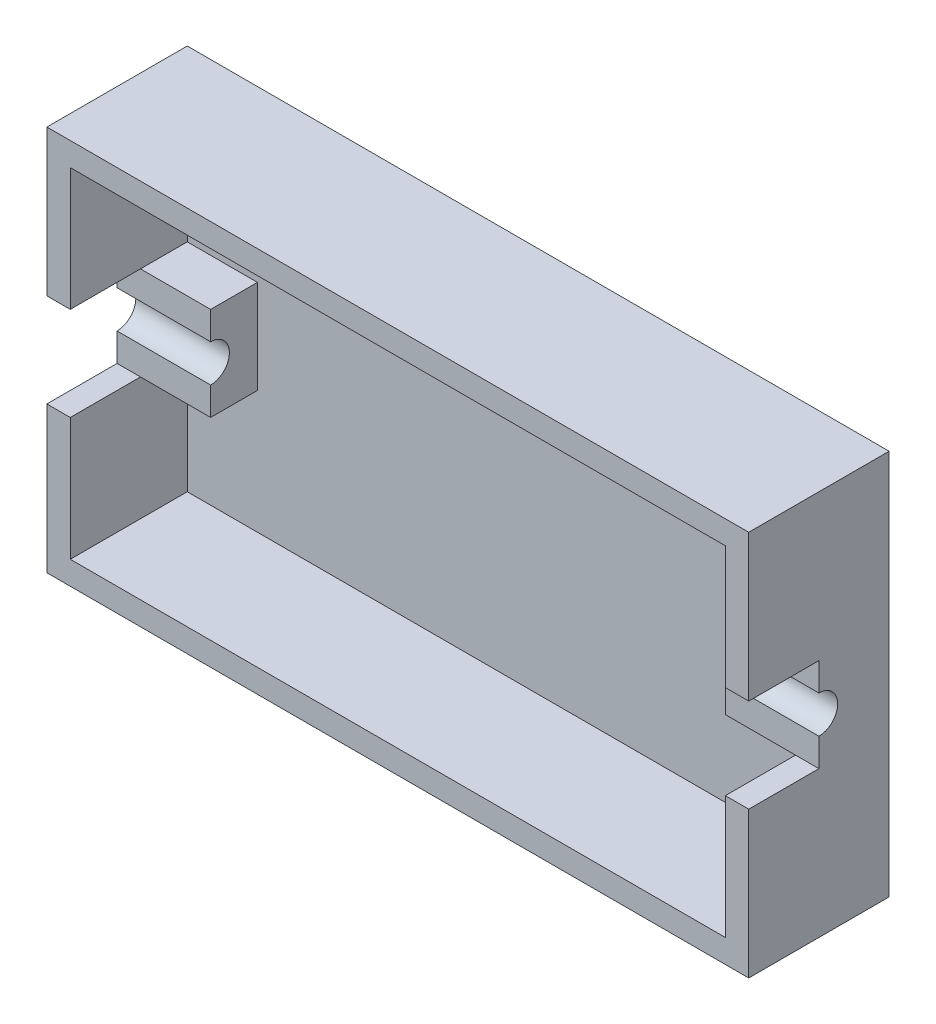
ISO-10303-21;
HEADER;
FILE_DESCRIPTION(('STEP AP214'),'2;1');
FILE_NAME('part.step','',(''),(''),'','','');
FILE_SCHEMA(('AUTOMOTIVE_DESIGN { 1 0 10303 214 1 1 1 1 }'));
ENDSEC;
DATA;
#1=APPLICATION_CONTEXT('core data for automotive mechanical design processes');
#2=APPLICATION_PROTOCOL_DEFINITION('international standard','automotive_design',2000,#1);
#3=PRODUCT_CONTEXT('',#1,'mechanical');
#4=PRODUCT('Part','Part','',(#3));
#5=PRODUCT_RELATED_PRODUCT_CATEGORY('part','',(#4));
#6=PRODUCT_DEFINITION_FORMATION('','',#4);
#7=PRODUCT_DEFINITION_CONTEXT('part definition',#1,'design');
#8=PRODUCT_DEFINITION('design','',#6,#7);
#9=PRODUCT_DEFINITION_SHAPE('','',#8);
#10=(LENGTH_UNIT() NAMED_UNIT(*) SI_UNIT(.MILLI.,.METRE.));
#11=(NAMED_UNIT(*) PLANE_ANGLE_UNIT() SI_UNIT($,.RADIAN.));
#12=(NAMED_UNIT(*) SI_UNIT($,.STERADIAN.) SOLID_ANGLE_UNIT());
#13=UNCERTAINTY_MEASURE_WITH_UNIT(LENGTH_MEASURE(1.E-05),#10,'distance_accuracy_value','');
#14=(GEOMETRIC_REPRESENTATION_CONTEXT(3) GLOBAL_UNCERTAINTY_ASSIGNED_CONTEXT((#13)) GLOBAL_UNIT_ASSIGNED_CONTEXT((#10,
#11,#12)) REPRESENTATION_CONTEXT('',''));
#15=CARTESIAN_POINT('',(0.,0.,0.));
#16=DIRECTION('',(0.,0.,1.));
#17=DIRECTION('',(1.,0.,0.));
#18=AXIS2_PLACEMENT_3D('',#15,#16,#17);
#19=CARTESIAN_POINT('',(0.,0.,30.));
#20=DIRECTION('',(0.,0.,1.));
#21=DIRECTION('',(1.,0.,0.));
#22=AXIS2_PLACEMENT_3D('',#19,#20,#21);
#23=PLANE('',#22);
#24=DIRECTION('',(1.,0.,0.));
#25=VECTOR('',#24,1.);
#26=CARTESIAN_POINT('',(-1.08330852705849E-13,74.5,30.));
#27=LINE('',#26,#25);
#28=CARTESIAN_POINT('',(-1.08330852705849E-13,74.5,30.));
#29=VERTEX_POINT('',#28);
#30=CARTESIAN_POINT('',(39.9999999999999,74.5,30.));
#31=VERTEX_POINT('',#30);
#32=EDGE_CURVE('E399',#29,#31,#27,.T.);
#33=ORIENTED_EDGE('',*,*,#32,.F.);
#34=DIRECTION('',(0.,-1.,0.));
#35=VECTOR('',#34,1.);
#36=CARTESIAN_POINT('',(0.,102.5,30.));
#37=LINE('',#36,#35);
#38=CARTESIAN_POINT('',(0.,62.5,30.));
#39=VERTEX_POINT('',#38);
#40=EDGE_CURVE('E261',#29,#39,#37,.T.);
#41=ORIENTED_EDGE('',*,*,#40,.T.);
#42=DIRECTION('',(1.,0.,0.));
#43=VECTOR('',#42,1.);
#44=CARTESIAN_POINT('',(0.,62.5,30.));
#45=LINE('',#44,#43);
#46=CARTESIAN_POINT('',(9.99999999999998,62.5,30.));
#47=VERTEX_POINT('',#46);
#48=EDGE_CURVE('E262',#39,#47,#45,.T.);
#49=ORIENTED_EDGE('',*,*,#48,.T.);
#50=CARTESIAN_POINT('',(40.,62.5,30.));
#51=VERTEX_POINT('',#50);
#52=EDGE_CURVE('E260',#47,#51,#45,.T.);
#53=ORIENTED_EDGE('',*,*,#52,.T.);
#54=DIRECTION('',(0.,1.,0.));
#55=VECTOR('',#54,1.);
#56=CARTESIAN_POINT('',(39.9999999999999,102.5,30.));
#57=LINE('',#56,#55);
#58=EDGE_CURVE('E266',#51,#31,#57,.T.);
#59=ORIENTED_EDGE('',*,*,#58,.T.);
#60=EDGE_LOOP('',(#33,#41,#49,#53,#59));
#61=FACE_BOUND('',#60,.T.);
#62=ADVANCED_FACE('F41',(#61),#23,.T.);
#63=CARTESIAN_POINT('',(0.,0.,30.));
#64=DIRECTION('',(0.,0.,1.));
#65=DIRECTION('',(1.,0.,0.));
#66=AXIS2_PLACEMENT_3D('',#63,#64,#65);
#67=PLANE('',#66);
#68=DIRECTION('',(1.,0.,0.));
#69=VECTOR('',#68,1.);
#70=CARTESIAN_POINT('',(-1.08330852705849E-13,74.5,30.));
#71=LINE('',#70,#69);
#72=CARTESIAN_POINT('',(260.,74.5000000000001,30.));
#73=VERTEX_POINT('',#72);
#74=CARTESIAN_POINT('',(300.,74.5000000000001,30.));
#75=VERTEX_POINT('',#74);
#76=EDGE_CURVE('E11',#73,#75,#71,.T.);
#77=ORIENTED_EDGE('',*,*,#76,.F.);
#78=DIRECTION('',(0.,-1.,0.));
#79=VECTOR('',#78,1.);
#80=CARTESIAN_POINT('',(260.,102.5,30.));
#81=LINE('',#80,#79);
#82=CARTESIAN_POINT('',(260.,62.5000000000001,30.));
#83=VERTEX_POINT('',#82);
#84=EDGE_CURVE('E317',#73,#83,#81,.T.);
#85=ORIENTED_EDGE('',*,*,#84,.T.);
#86=DIRECTION('',(1.,0.,0.));
#87=VECTOR('',#86,1.);
#88=CARTESIAN_POINT('',(300.,62.5000000000001,30.));
#89=LINE('',#88,#87);
#90=CARTESIAN_POINT('',(290.,62.5000000000001,30.));
#91=VERTEX_POINT('',#90);
#92=EDGE_CURVE('E240',#83,#91,#89,.T.);
#93=ORIENTED_EDGE('',*,*,#92,.T.);
#94=CARTESIAN_POINT('',(300.,62.5000000000001,30.));
#95=VERTEX_POINT('',#94);
#96=EDGE_CURVE('E231',#91,#95,#89,.T.);
#97=ORIENTED_EDGE('',*,*,#96,.T.);
#98=DIRECTION('',(0.,1.,0.));
#99=VECTOR('',#98,1.);
#100=CARTESIAN_POINT('',(300.,102.5,30.));
#101=LINE('',#100,#99);
#102=EDGE_CURVE('E222',#95,#75,#101,.T.);
#103=ORIENTED_EDGE('',*,*,#102,.T.);
#104=EDGE_LOOP('',(#77,#85,#93,#97,#103));
#105=FACE_BOUND('',#104,.T.);
#106=ADVANCED_FACE('F229',(#105),#67,.T.);
#107=CARTESIAN_POINT('',(0.,0.,10.));
#108=DIRECTION('',(0.,0.,-1.));
#109=DIRECTION('',(-1.,0.,0.));
#110=AXIS2_PLACEMENT_3D('',#107,#108,#109);
#111=PLANE('',#110);
#112=DIRECTION('',(1.,0.,0.));
#113=VECTOR('',#112,1.);
#114=CARTESIAN_POINT('',(0.,10.,10.));
#115=LINE('',#114,#113);
#116=CARTESIAN_POINT('',(9.99999999999998,10.,10.));
#117=VERTEX_POINT('',#116);
#118=CARTESIAN_POINT('',(290.,10.,10.));
#119=VERTEX_POINT('',#118);
#120=EDGE_CURVE('E393',#117,#119,#115,.T.);
#121=ORIENTED_EDGE('',*,*,#120,.T.);
#122=DIRECTION('',(0.,1.,0.));
#123=VECTOR('',#122,1.);
#124=CARTESIAN_POINT('',(290.,0.,10.));
#125=LINE('',#124,#123);
#126=CARTESIAN_POINT('',(290.,62.5000000000001,10.));
#127=VERTEX_POINT('',#126);
#128=EDGE_CURVE('E396',#119,#127,#125,.T.);
#129=ORIENTED_EDGE('',*,*,#128,.T.);
#130=DIRECTION('',(1.,0.,0.));
#131=VECTOR('',#130,1.);
#132=CARTESIAN_POINT('',(300.,62.5000000000001,10.));
#133=LINE('',#132,#131);
#134=CARTESIAN_POINT('',(260.,62.5000000000001,10.));
#135=VERTEX_POINT('',#134);
#136=EDGE_CURVE('E250',#135,#127,#133,.T.);
#137=ORIENTED_EDGE('',*,*,#136,.F.);
#138=DIRECTION('',(0.,-1.,0.));
#139=VECTOR('',#138,1.);
#140=CARTESIAN_POINT('',(260.,102.5,10.));
#141=LINE('',#140,#139);
#142=CARTESIAN_POINT('',(260.,102.5,10.));
#143=VERTEX_POINT('',#142);
#144=EDGE_CURVE('E246',#143,#135,#141,.T.);
#145=ORIENTED_EDGE('',*,*,#144,.F.);
#146=DIRECTION('',(-1.,0.,0.));
#147=VECTOR('',#146,1.);
#148=CARTESIAN_POINT('',(300.,102.5,10.));
#149=LINE('',#148,#147);
#150=CARTESIAN_POINT('',(290.,102.5,10.));
#151=VERTEX_POINT('',#150);
#152=EDGE_CURVE('E244',#151,#143,#149,.T.);
#153=ORIENTED_EDGE('',*,*,#152,.F.);
#154=DIRECTION('',(0.,1.,0.));
#155=VECTOR('',#154,1.);
#156=CARTESIAN_POINT('',(290.,0.,10.));
#157=LINE('',#156,#155);
#158=CARTESIAN_POINT('',(290.,155.,10.));
#159=VERTEX_POINT('',#158);
#160=EDGE_CURVE('E341',#151,#159,#157,.T.);
#161=ORIENTED_EDGE('',*,*,#160,.T.);
#162=DIRECTION('',(-1.,0.,0.));
#163=VECTOR('',#162,1.);
#164=CARTESIAN_POINT('',(0.,155.,10.));
#165=LINE('',#164,#163);
#166=CARTESIAN_POINT('',(9.99999999999994,155.,10.));
#167=VERTEX_POINT('',#166);
#168=EDGE_CURVE('E345',#159,#167,#165,.T.);
#169=ORIENTED_EDGE('',*,*,#168,.T.);
#170=DIRECTION('',(0.,-1.,0.));
#171=VECTOR('',#170,1.);
#172=CARTESIAN_POINT('',(9.99999999999994,0.,10.));
#173=LINE('',#172,#171);
#174=CARTESIAN_POINT('',(9.99999999999994,102.5,10.));
#175=VERTEX_POINT('',#174);
#176=EDGE_CURVE('E348',#167,#175,#173,.T.);
#177=ORIENTED_EDGE('',*,*,#176,.T.);
#178=DIRECTION('',(-1.,0.,0.));
#179=VECTOR('',#178,1.);
#180=CARTESIAN_POINT('',(0.,102.5,10.));
#181=LINE('',#180,#179);
#182=CARTESIAN_POINT('',(39.9999999999999,102.5,10.));
#183=VERTEX_POINT('',#182);
#184=EDGE_CURVE('E278',#183,#175,#181,.T.);
#185=ORIENTED_EDGE('',*,*,#184,.F.);
#186=DIRECTION('',(0.,1.,0.));
#187=VECTOR('',#186,1.);
#188=CARTESIAN_POINT('',(39.9999999999999,102.5,10.));
#189=LINE('',#188,#187);
#190=CARTESIAN_POINT('',(40.,62.5,10.));
#191=VERTEX_POINT('',#190);
#192=EDGE_CURVE('E275',#191,#183,#189,.T.);
#193=ORIENTED_EDGE('',*,*,#192,.F.);
#194=DIRECTION('',(1.,0.,0.));
#195=VECTOR('',#194,1.);
#196=CARTESIAN_POINT('',(0.,62.5,10.));
#197=LINE('',#196,#195);
#198=CARTESIAN_POINT('',(9.99999999999998,62.5,10.));
#199=VERTEX_POINT('',#198);
#200=EDGE_CURVE('E256',#199,#191,#197,.T.);
#201=ORIENTED_EDGE('',*,*,#200,.F.);
#202=DIRECTION('',(0.,-1.,0.));
#203=VECTOR('',#202,1.);
#204=CARTESIAN_POINT('',(9.99999999999998,0.,10.));
#205=LINE('',#204,#203);
#206=EDGE_CURVE('E389',#199,#117,#205,.T.);
#207=ORIENTED_EDGE('',*,*,#206,.T.);
#208=EDGE_LOOP('',(#121,#129,#137,#145,#153,#161,#169,#177,#185,#193,#201,#207));
#209=FACE_BOUND('',#208,.T.);
#210=ADVANCED_FACE('F449',(#209),#111,.F.);
#211=CARTESIAN_POINT('',(0.,0.,10.));
#212=DIRECTION('',(1.,0.,0.));
#213=DIRECTION('',(0.,1.,0.));
#214=AXIS2_PLACEMENT_3D('',#211,#212,#213);
#215=PLANE('',#214);
#216=ORIENTED_EDGE('',*,*,#40,.F.);
#217=CARTESIAN_POINT('',(-1.11022302462516E-13,82.5,30.));
#218=DIRECTION('',(1.,0.,0.));
#219=DIRECTION('',(0.,1.,0.));
#220=AXIS2_PLACEMENT_3D('',#217,#218,#219);
#221=CIRCLE('',#220,8.);
#222=CARTESIAN_POINT('',(-1.13713752219183E-13,90.5,30.));
#223=VERTEX_POINT('',#222);
#224=EDGE_CURVE('E226',#29,#223,#221,.T.);
#225=ORIENTED_EDGE('',*,*,#224,.T.);
#226=CARTESIAN_POINT('',(0.,102.5,30.));
#227=VERTEX_POINT('',#226);
#228=EDGE_CURVE('E257',#227,#223,#37,.T.);
#229=ORIENTED_EDGE('',*,*,#228,.F.);
#230=DIRECTION('',(0.,0.,-1.));
#231=VECTOR('',#230,1.);
#232=CARTESIAN_POINT('',(0.,102.5,60.));
#233=LINE('',#232,#231);
#234=CARTESIAN_POINT('',(0.,102.5,60.));
#235=VERTEX_POINT('',#234);
#236=EDGE_CURVE('E335',#235,#227,#233,.T.);
#237=ORIENTED_EDGE('',*,*,#236,.F.);
#238=DIRECTION('',(0.,-1.,0.));
#239=VECTOR('',#238,1.);
#240=CARTESIAN_POINT('',(0.,0.,60.));
#241=LINE('',#240,#239);
#242=CARTESIAN_POINT('',(0.,165.,60.));
#243=VERTEX_POINT('',#242);
#244=EDGE_CURVE('E354',#243,#235,#241,.T.);
#245=ORIENTED_EDGE('',*,*,#244,.F.);
#246=DIRECTION('',(0.,0.,-1.));
#247=VECTOR('',#246,1.);
#248=CARTESIAN_POINT('',(0.,165.,10.));
#249=LINE('',#248,#247);
#250=CARTESIAN_POINT('',(0.,165.,0.));
#251=VERTEX_POINT('',#250);
#252=EDGE_CURVE('E296',#243,#251,#249,.T.);
#253=ORIENTED_EDGE('',*,*,#252,.T.);
#254=DIRECTION('',(0.,-1.,0.));
#255=VECTOR('',#254,1.);
#256=CARTESIAN_POINT('',(0.,0.,0.));
#257=LINE('',#256,#255);
#258=CARTESIAN_POINT('',(0.,0.,0.));
#259=VERTEX_POINT('',#258);
#260=EDGE_CURVE('E286',#251,#259,#257,.T.);
#261=ORIENTED_EDGE('',*,*,#260,.T.);
#262=DIRECTION('',(0.,0.,-1.));
#263=VECTOR('',#262,1.);
#264=CARTESIAN_POINT('',(0.,0.,10.));
#265=LINE('',#264,#263);
#266=CARTESIAN_POINT('',(0.,0.,60.));
#267=VERTEX_POINT('',#266);
#268=EDGE_CURVE('E307',#267,#259,#265,.T.);
#269=ORIENTED_EDGE('',*,*,#268,.F.);
#270=DIRECTION('',(0.,-1.,0.));
#271=VECTOR('',#270,1.);
#272=CARTESIAN_POINT('',(0.,0.,60.));
#273=LINE('',#272,#271);
#274=CARTESIAN_POINT('',(0.,62.5,60.));
#275=VERTEX_POINT('',#274);
#276=EDGE_CURVE('E408',#275,#267,#273,.T.);
#277=ORIENTED_EDGE('',*,*,#276,.F.);
#278=DIRECTION('',(0.,0.,-1.));
#279=VECTOR('',#278,1.);
#280=CARTESIAN_POINT('',(0.,62.5,60.));
#281=LINE('',#280,#279);
#282=EDGE_CURVE('E380',#275,#39,#281,.T.);
#283=ORIENTED_EDGE('',*,*,#282,.T.);
#284=EDGE_LOOP('',(#216,#225,#229,#237,#245,#253,#261,#269,#277,#283));
#285=FACE_BOUND('',#284,.T.);
#286=ADVANCED_FACE('F43',(#285),#215,.F.);
#287=CARTESIAN_POINT('',(0.,0.,10.));
#288=DIRECTION('',(0.,1.,0.));
#289=DIRECTION('',(0.,0.,1.));
#290=AXIS2_PLACEMENT_3D('',#287,#288,#289);
#291=PLANE('',#290);
#292=DIRECTION('',(1.,0.,0.));
#293=VECTOR('',#292,1.);
#294=CARTESIAN_POINT('',(0.,0.,0.));
#295=LINE('',#294,#293);
#296=CARTESIAN_POINT('',(300.,0.,0.));
#297=VERTEX_POINT('',#296);
#298=EDGE_CURVE('E289',#259,#297,#295,.T.);
#299=ORIENTED_EDGE('',*,*,#298,.T.);
#300=DIRECTION('',(0.,0.,-1.));
#301=VECTOR('',#300,1.);
#302=CARTESIAN_POINT('',(300.,0.,10.));
#303=LINE('',#302,#301);
#304=CARTESIAN_POINT('',(300.,0.,60.));
#305=VERTEX_POINT('',#304);
#306=EDGE_CURVE('E303',#305,#297,#303,.T.);
#307=ORIENTED_EDGE('',*,*,#306,.F.);
#308=DIRECTION('',(1.,0.,0.));
#309=VECTOR('',#308,1.);
#310=CARTESIAN_POINT('',(0.,0.,60.));
#311=LINE('',#310,#309);
#312=EDGE_CURVE('E405',#267,#305,#311,.T.);
#313=ORIENTED_EDGE('',*,*,#312,.F.);
#314=ORIENTED_EDGE('',*,*,#268,.T.);
#315=EDGE_LOOP('',(#299,#307,#313,#314));
#316=FACE_BOUND('',#315,.T.);
#317=ADVANCED_FACE('F500',(#316),#291,.F.);
#318=CARTESIAN_POINT('',(300.,0.,10.));
#319=DIRECTION('',(-1.,0.,0.));
#320=DIRECTION('',(0.,-1.,0.));
#321=AXIS2_PLACEMENT_3D('',#318,#319,#320);
#322=PLANE('',#321);
#323=CARTESIAN_POINT('',(300.,90.5000000000001,30.));
#324=VERTEX_POINT('',#323);
#325=CARTESIAN_POINT('',(300.,102.5,30.));
#326=VERTEX_POINT('',#325);
#327=EDGE_CURVE('E224',#324,#326,#101,.T.);
#328=ORIENTED_EDGE('',*,*,#327,.F.);
#329=CARTESIAN_POINT('',(300.,82.5000000000001,30.));
#330=DIRECTION('',(1.,0.,0.));
#331=DIRECTION('',(0.,1.,0.));
#332=AXIS2_PLACEMENT_3D('',#329,#330,#331);
#333=CIRCLE('',#332,8.);
#334=EDGE_CURVE('E63',#75,#324,#333,.T.);
#335=ORIENTED_EDGE('',*,*,#334,.F.);
#336=ORIENTED_EDGE('',*,*,#102,.F.);
#337=DIRECTION('',(0.,0.,-1.));
#338=VECTOR('',#337,1.);
#339=CARTESIAN_POINT('',(300.,62.5000000000001,60.));
#340=LINE('',#339,#338);
#341=CARTESIAN_POINT('',(300.,62.5000000000001,60.));
#342=VERTEX_POINT('',#341);
#343=EDGE_CURVE('E383',#342,#95,#340,.T.);
#344=ORIENTED_EDGE('',*,*,#343,.F.);
#345=DIRECTION('',(0.,1.,0.));
#346=VECTOR('',#345,1.);
#347=CARTESIAN_POINT('',(300.,1.00929365875014E-13,60.));
#348=LINE('',#347,#346);
#349=EDGE_CURVE('E402',#305,#342,#348,.T.);
#350=ORIENTED_EDGE('',*,*,#349,.F.);
#351=ORIENTED_EDGE('',*,*,#306,.T.);
#352=DIRECTION('',(0.,1.,0.));
#353=VECTOR('',#352,1.);
#354=CARTESIAN_POINT('',(300.,0.,0.));
#355=LINE('',#354,#353);
#356=CARTESIAN_POINT('',(300.,165.,0.));
#357=VERTEX_POINT('',#356);
#358=EDGE_CURVE('E291',#297,#357,#355,.T.);
#359=ORIENTED_EDGE('',*,*,#358,.T.);
#360=DIRECTION('',(0.,0.,-1.));
#361=VECTOR('',#360,1.);
#362=CARTESIAN_POINT('',(300.,165.,10.));
#363=LINE('',#362,#361);
#364=CARTESIAN_POINT('',(300.,165.,60.));
#365=VERTEX_POINT('',#364);
#366=EDGE_CURVE('E299',#365,#357,#363,.T.);
#367=ORIENTED_EDGE('',*,*,#366,.F.);
#368=DIRECTION('',(0.,1.,0.));
#369=VECTOR('',#368,1.);
#370=CARTESIAN_POINT('',(300.,1.00929365875014E-13,60.));
#371=LINE('',#370,#369);
#372=CARTESIAN_POINT('',(300.,102.5,60.));
#373=VERTEX_POINT('',#372);
#374=EDGE_CURVE('E359',#373,#365,#371,.T.);
#375=ORIENTED_EDGE('',*,*,#374,.F.);
#376=DIRECTION('',(0.,0.,-1.));
#377=VECTOR('',#376,1.);
#378=CARTESIAN_POINT('',(300.,102.5,60.));
#379=LINE('',#378,#377);
#380=EDGE_CURVE('E332',#373,#326,#379,.T.);
#381=ORIENTED_EDGE('',*,*,#380,.T.);
#382=EDGE_LOOP('',(#328,#335,#336,#344,#350,#351,#359,#367,#375,#381));
#383=FACE_BOUND('',#382,.T.);
#384=ADVANCED_FACE('F220',(#383),#322,.F.);
#385=CARTESIAN_POINT('',(0.,165.,10.));
#386=DIRECTION('',(0.,-1.,0.));
#387=DIRECTION('',(0.,0.,-1.));
#388=AXIS2_PLACEMENT_3D('',#385,#386,#387);
#389=PLANE('',#388);
#390=DIRECTION('',(-1.,0.,0.));
#391=VECTOR('',#390,1.);
#392=CARTESIAN_POINT('',(0.,165.,0.));
#393=LINE('',#392,#391);
#394=EDGE_CURVE('E294',#357,#251,#393,.T.);
#395=ORIENTED_EDGE('',*,*,#394,.T.);
#396=ORIENTED_EDGE('',*,*,#252,.F.);
#397=DIRECTION('',(-1.,0.,0.));
#398=VECTOR('',#397,1.);
#399=CARTESIAN_POINT('',(0.,165.,60.));
#400=LINE('',#399,#398);
#401=EDGE_CURVE('E356',#365,#243,#400,.T.);
#402=ORIENTED_EDGE('',*,*,#401,.F.);
#403=ORIENTED_EDGE('',*,*,#366,.T.);
#404=EDGE_LOOP('',(#395,#396,#402,#403));
#405=FACE_BOUND('',#404,.T.);
#406=ADVANCED_FACE('F542',(#405),#389,.F.);
#407=CARTESIAN_POINT('',(0.,0.,0.));
#408=DIRECTION('',(0.,0.,-1.));
#409=DIRECTION('',(-1.,0.,0.));
#410=AXIS2_PLACEMENT_3D('',#407,#408,#409);
#411=PLANE('',#410);
#412=ORIENTED_EDGE('',*,*,#260,.F.);
#413=ORIENTED_EDGE('',*,*,#394,.F.);
#414=ORIENTED_EDGE('',*,*,#358,.F.);
#415=ORIENTED_EDGE('',*,*,#298,.F.);
#416=EDGE_LOOP('',(#412,#413,#414,#415));
#417=FACE_BOUND('',#416,.T.);
#418=ADVANCED_FACE('F496',(#417),#411,.T.);
#419=CARTESIAN_POINT('',(0.,62.5,30.));
#420=DIRECTION('',(0.,1.,0.));
#421=DIRECTION('',(0.,0.,1.));
#422=AXIS2_PLACEMENT_3D('',#419,#420,#421);
#423=PLANE('',#422);
#424=ORIENTED_EDGE('',*,*,#52,.F.);
#425=DIRECTION('',(0.,0.,-1.));
#426=VECTOR('',#425,1.);
#427=CARTESIAN_POINT('',(9.99999999999998,62.5,60.));
#428=LINE('',#427,#426);
#429=EDGE_CURVE('E379',#47,#199,#428,.T.);
#430=ORIENTED_EDGE('',*,*,#429,.T.);
#431=ORIENTED_EDGE('',*,*,#200,.T.);
#432=DIRECTION('',(0.,0.,-1.));
#433=VECTOR('',#432,1.);
#434=CARTESIAN_POINT('',(40.,62.5,30.));
#435=LINE('',#434,#433);
#436=EDGE_CURVE('E283',#51,#191,#435,.T.);
#437=ORIENTED_EDGE('',*,*,#436,.F.);
#438=EDGE_LOOP('',(#424,#430,#431,#437));
#439=FACE_BOUND('',#438,.T.);
#440=ADVANCED_FACE('F457',(#439),#423,.F.);
#441=CARTESIAN_POINT('',(39.9999999999999,102.5,30.));
#442=DIRECTION('',(-1.,0.,0.));
#443=DIRECTION('',(0.,-1.,0.));
#444=AXIS2_PLACEMENT_3D('',#441,#442,#443);
#445=PLANE('',#444);
#446=CARTESIAN_POINT('',(39.9999999999999,90.5,30.));
#447=VERTEX_POINT('',#446);
#448=CARTESIAN_POINT('',(39.9999999999999,102.5,30.));
#449=VERTEX_POINT('',#448);
#450=EDGE_CURVE('E265',#447,#449,#57,.T.);
#451=ORIENTED_EDGE('',*,*,#450,.F.);
#452=CARTESIAN_POINT('',(39.9999999999999,82.5,30.));
#453=DIRECTION('',(-1.,0.,0.));
#454=DIRECTION('',(0.,-1.,0.));
#455=AXIS2_PLACEMENT_3D('',#452,#453,#454);
#456=CIRCLE('',#455,8.);
#457=EDGE_CURVE('E56',#447,#31,#456,.T.);
#458=ORIENTED_EDGE('',*,*,#457,.T.);
#459=ORIENTED_EDGE('',*,*,#58,.F.);
#460=ORIENTED_EDGE('',*,*,#436,.T.);
#461=ORIENTED_EDGE('',*,*,#192,.T.);
#462=DIRECTION('',(0.,0.,-1.));
#463=VECTOR('',#462,1.);
#464=CARTESIAN_POINT('',(39.9999999999999,102.5,30.));
#465=LINE('',#464,#463);
#466=EDGE_CURVE('E273',#449,#183,#465,.T.);
#467=ORIENTED_EDGE('',*,*,#466,.F.);
#468=EDGE_LOOP('',(#451,#458,#459,#460,#461,#467));
#469=FACE_BOUND('',#468,.T.);
#470=ADVANCED_FACE('F452',(#469),#445,.F.);
#471=CARTESIAN_POINT('',(0.,102.5,30.));
#472=DIRECTION('',(0.,-1.,0.));
#473=DIRECTION('',(0.,0.,-1.));
#474=AXIS2_PLACEMENT_3D('',#471,#472,#473);
#475=PLANE('',#474);
#476=ORIENTED_EDGE('',*,*,#184,.T.);
#477=DIRECTION('',(0.,0.,-1.));
#478=VECTOR('',#477,1.);
#479=CARTESIAN_POINT('',(9.99999999999994,102.5,60.));
#480=LINE('',#479,#478);
#481=CARTESIAN_POINT('',(9.99999999999994,102.5,30.));
#482=VERTEX_POINT('',#481);
#483=EDGE_CURVE('E340',#482,#175,#480,.T.);
#484=ORIENTED_EDGE('',*,*,#483,.F.);
#485=DIRECTION('',(-1.,0.,0.));
#486=VECTOR('',#485,1.);
#487=CARTESIAN_POINT('',(0.,102.5,30.));
#488=LINE('',#487,#486);
#489=EDGE_CURVE('E270',#449,#482,#488,.T.);
#490=ORIENTED_EDGE('',*,*,#489,.F.);
#491=ORIENTED_EDGE('',*,*,#466,.T.);
#492=EDGE_LOOP('',(#476,#484,#490,#491));
#493=FACE_BOUND('',#492,.T.);
#494=ADVANCED_FACE('F445',(#493),#475,.F.);
#495=DIRECTION('',(1.,0.,0.));
#496=VECTOR('',#495,1.);
#497=CARTESIAN_POINT('',(-1.13713752219183E-13,90.5,30.));
#498=LINE('',#497,#496);
#499=EDGE_CURVE('E318',#447,#223,#498,.F.);
#500=ORIENTED_EDGE('',*,*,#499,.F.);
#501=ORIENTED_EDGE('',*,*,#450,.T.);
#502=ORIENTED_EDGE('',*,*,#489,.T.);
#503=EDGE_CURVE('E269',#482,#227,#488,.T.);
#504=ORIENTED_EDGE('',*,*,#503,.T.);
#505=ORIENTED_EDGE('',*,*,#228,.T.);
#506=EDGE_LOOP('',(#500,#501,#502,#504,#505));
#507=FACE_BOUND('',#506,.T.);
#508=ADVANCED_FACE('F432',(#507),#23,.T.);
#509=CARTESIAN_POINT('',(300.,102.5,30.));
#510=DIRECTION('',(0.,-1.,0.));
#511=DIRECTION('',(1.,0.,0.));
#512=AXIS2_PLACEMENT_3D('',#509,#510,#511);
#513=PLANE('',#512);
#514=DIRECTION('',(-1.,0.,0.));
#515=VECTOR('',#514,1.);
#516=CARTESIAN_POINT('',(300.,102.5,30.));
#517=LINE('',#516,#515);
#518=CARTESIAN_POINT('',(290.,102.5,30.));
#519=VERTEX_POINT('',#518);
#520=CARTESIAN_POINT('',(260.,102.5,30.));
#521=VERTEX_POINT('',#520);
#522=EDGE_CURVE('E252',#519,#521,#517,.T.);
#523=ORIENTED_EDGE('',*,*,#522,.F.);
#524=DIRECTION('',(0.,0.,-1.));
#525=VECTOR('',#524,1.);
#526=CARTESIAN_POINT('',(290.,102.5,60.));
#527=LINE('',#526,#525);
#528=EDGE_CURVE('E331',#519,#151,#527,.T.);
#529=ORIENTED_EDGE('',*,*,#528,.T.);
#530=ORIENTED_EDGE('',*,*,#152,.T.);
#531=DIRECTION('',(0.,0.,-1.));
#532=VECTOR('',#531,1.);
#533=CARTESIAN_POINT('',(260.,102.5,30.));
#534=LINE('',#533,#532);
#535=EDGE_CURVE('E237',#521,#143,#534,.T.);
#536=ORIENTED_EDGE('',*,*,#535,.F.);
#537=EDGE_LOOP('',(#523,#529,#530,#536));
#538=FACE_BOUND('',#537,.T.);
#539=ADVANCED_FACE('F478',(#538),#513,.F.);
#540=CARTESIAN_POINT('',(260.,102.5,30.));
#541=DIRECTION('',(1.,0.,0.));
#542=DIRECTION('',(0.,1.,0.));
#543=AXIS2_PLACEMENT_3D('',#540,#541,#542);
#544=PLANE('',#543);
#545=ORIENTED_EDGE('',*,*,#84,.F.);
#546=CARTESIAN_POINT('',(260.,82.5000000000001,30.));
#547=DIRECTION('',(1.,0.,0.));
#548=DIRECTION('',(0.,1.,0.));
#549=AXIS2_PLACEMENT_3D('',#546,#547,#548);
#550=CIRCLE('',#549,8.);
#551=CARTESIAN_POINT('',(260.,90.5000000000001,30.));
#552=VERTEX_POINT('',#551);
#553=EDGE_CURVE('E213',#73,#552,#550,.T.);
#554=ORIENTED_EDGE('',*,*,#553,.T.);
#555=EDGE_CURVE('E314',#521,#552,#81,.T.);
#556=ORIENTED_EDGE('',*,*,#555,.F.);
#557=ORIENTED_EDGE('',*,*,#535,.T.);
#558=ORIENTED_EDGE('',*,*,#144,.T.);
#559=DIRECTION('',(0.,0.,-1.));
#560=VECTOR('',#559,1.);
#561=CARTESIAN_POINT('',(260.,62.5000000000001,30.));
#562=LINE('',#561,#560);
#563=EDGE_CURVE('E233',#83,#135,#562,.T.);
#564=ORIENTED_EDGE('',*,*,#563,.F.);
#565=EDGE_LOOP('',(#545,#554,#556,#557,#558,#564));
#566=FACE_BOUND('',#565,.T.);
#567=ADVANCED_FACE('F313',(#566),#544,.F.);
#568=CARTESIAN_POINT('',(300.,62.5000000000001,30.));
#569=DIRECTION('',(0.,1.,0.));
#570=DIRECTION('',(-1.,0.,0.));
#571=AXIS2_PLACEMENT_3D('',#568,#569,#570);
#572=PLANE('',#571);
#573=ORIENTED_EDGE('',*,*,#136,.T.);
#574=DIRECTION('',(0.,0.,-1.));
#575=VECTOR('',#574,1.);
#576=CARTESIAN_POINT('',(290.,62.5000000000001,60.));
#577=LINE('',#576,#575);
#578=EDGE_CURVE('E388',#91,#127,#577,.T.);
#579=ORIENTED_EDGE('',*,*,#578,.F.);
#580=ORIENTED_EDGE('',*,*,#92,.F.);
#581=ORIENTED_EDGE('',*,*,#563,.T.);
#582=EDGE_LOOP('',(#573,#579,#580,#581));
#583=FACE_BOUND('',#582,.T.);
#584=ADVANCED_FACE('F473',(#583),#572,.F.);
#585=DIRECTION('',(1.,0.,0.));
#586=VECTOR('',#585,1.);
#587=CARTESIAN_POINT('',(-1.13713752219183E-13,90.5,30.));
#588=LINE('',#587,#586);
#589=EDGE_CURVE('E49',#324,#552,#588,.F.);
#590=ORIENTED_EDGE('',*,*,#589,.F.);
#591=ORIENTED_EDGE('',*,*,#327,.T.);
#592=EDGE_CURVE('E323',#326,#519,#517,.T.);
#593=ORIENTED_EDGE('',*,*,#592,.T.);
#594=ORIENTED_EDGE('',*,*,#522,.T.);
#595=ORIENTED_EDGE('',*,*,#555,.T.);
#596=EDGE_LOOP('',(#590,#591,#593,#594,#595));
#597=FACE_BOUND('',#596,.T.);
#598=ADVANCED_FACE('F320',(#597),#67,.T.);
#599=CARTESIAN_POINT('',(9.99999999999994,0.,60.));
#600=DIRECTION('',(1.,0.,0.));
#601=DIRECTION('',(0.,0.,-1.));
#602=AXIS2_PLACEMENT_3D('',#599,#600,#601);
#603=PLANE('',#602);
#604=ORIENTED_EDGE('',*,*,#176,.F.);
#605=DIRECTION('',(0.,0.,-1.));
#606=VECTOR('',#605,1.);
#607=CARTESIAN_POINT('',(9.99999999999994,155.,60.));
#608=LINE('',#607,#606);
#609=CARTESIAN_POINT('',(9.99999999999994,155.,60.));
#610=VERTEX_POINT('',#609);
#611=EDGE_CURVE('E247',#610,#167,#608,.T.);
#612=ORIENTED_EDGE('',*,*,#611,.F.);
#613=DIRECTION('',(0.,-1.,0.));
#614=VECTOR('',#613,1.);
#615=CARTESIAN_POINT('',(9.99999999999994,0.,60.));
#616=LINE('',#615,#614);
#617=CARTESIAN_POINT('',(9.99999999999994,102.5,60.));
#618=VERTEX_POINT('',#617);
#619=EDGE_CURVE('E344',#610,#618,#616,.T.);
#620=ORIENTED_EDGE('',*,*,#619,.T.);
#621=EDGE_CURVE('E337',#618,#482,#480,.T.);
#622=ORIENTED_EDGE('',*,*,#621,.T.);
#623=ORIENTED_EDGE('',*,*,#483,.T.);
#624=EDGE_LOOP('',(#604,#612,#620,#622,#623));
#625=FACE_BOUND('',#624,.T.);
#626=ADVANCED_FACE('F442',(#625),#603,.T.);
#627=CARTESIAN_POINT('',(0.,155.,60.));
#628=DIRECTION('',(0.,-1.,0.));
#629=DIRECTION('',(0.,0.,-1.));
#630=AXIS2_PLACEMENT_3D('',#627,#628,#629);
#631=PLANE('',#630);
#632=ORIENTED_EDGE('',*,*,#168,.F.);
#633=DIRECTION('',(0.,0.,-1.));
#634=VECTOR('',#633,1.);
#635=CARTESIAN_POINT('',(290.,155.,60.));
#636=LINE('',#635,#634);
#637=CARTESIAN_POINT('',(290.,155.,60.));
#638=VERTEX_POINT('',#637);
#639=EDGE_CURVE('E327',#638,#159,#636,.T.);
#640=ORIENTED_EDGE('',*,*,#639,.F.);
#641=DIRECTION('',(-1.,0.,0.));
#642=VECTOR('',#641,1.);
#643=CARTESIAN_POINT('',(0.,155.,60.));
#644=LINE('',#643,#642);
#645=EDGE_CURVE('E368',#638,#610,#644,.T.);
#646=ORIENTED_EDGE('',*,*,#645,.T.);
#647=ORIENTED_EDGE('',*,*,#611,.T.);
#648=EDGE_LOOP('',(#632,#640,#646,#647));
#649=FACE_BOUND('',#648,.T.);
#650=ADVANCED_FACE('F487',(#649),#631,.T.);
#651=CARTESIAN_POINT('',(290.,0.,60.));
#652=DIRECTION('',(-1.,0.,0.));
#653=DIRECTION('',(0.,0.,1.));
#654=AXIS2_PLACEMENT_3D('',#651,#652,#653);
#655=PLANE('',#654);
#656=ORIENTED_EDGE('',*,*,#160,.F.);
#657=ORIENTED_EDGE('',*,*,#528,.F.);
#658=CARTESIAN_POINT('',(290.,102.5,60.));
#659=VERTEX_POINT('',#658);
#660=EDGE_CURVE('E329',#659,#519,#527,.T.);
#661=ORIENTED_EDGE('',*,*,#660,.F.);
#662=DIRECTION('',(0.,1.,0.));
#663=VECTOR('',#662,1.);
#664=CARTESIAN_POINT('',(290.,0.,60.));
#665=LINE('',#664,#663);
#666=EDGE_CURVE('E365',#659,#638,#665,.T.);
#667=ORIENTED_EDGE('',*,*,#666,.T.);
#668=ORIENTED_EDGE('',*,*,#639,.T.);
#669=EDGE_LOOP('',(#656,#657,#661,#667,#668));
#670=FACE_BOUND('',#669,.T.);
#671=ADVANCED_FACE('F481',(#670),#655,.T.);
#672=CARTESIAN_POINT('',(0.,102.5,60.));
#673=DIRECTION('',(0.,1.,0.));
#674=DIRECTION('',(-1.,0.,0.));
#675=AXIS2_PLACEMENT_3D('',#672,#673,#674);
#676=PLANE('',#675);
#677=ORIENTED_EDGE('',*,*,#592,.F.);
#678=ORIENTED_EDGE('',*,*,#380,.F.);
#679=DIRECTION('',(1.,0.,0.));
#680=VECTOR('',#679,1.);
#681=CARTESIAN_POINT('',(0.,102.5,60.));
#682=LINE('',#681,#680);
#683=EDGE_CURVE('E363',#659,#373,#682,.T.);
#684=ORIENTED_EDGE('',*,*,#683,.F.);
#685=ORIENTED_EDGE('',*,*,#660,.T.);
#686=EDGE_LOOP('',(#677,#678,#684,#685));
#687=FACE_BOUND('',#686,.T.);
#688=ADVANCED_FACE('F635',(#687),#676,.F.);
#689=CARTESIAN_POINT('',(0.,102.5,60.));
#690=DIRECTION('',(0.,1.,0.));
#691=DIRECTION('',(0.,0.,1.));
#692=AXIS2_PLACEMENT_3D('',#689,#690,#691);
#693=PLANE('',#692);
#694=ORIENTED_EDGE('',*,*,#503,.F.);
#695=ORIENTED_EDGE('',*,*,#621,.F.);
#696=DIRECTION('',(1.,0.,0.));
#697=VECTOR('',#696,1.);
#698=CARTESIAN_POINT('',(0.,102.5,60.));
#699=LINE('',#698,#697);
#700=EDGE_CURVE('E352',#235,#618,#699,.T.);
#701=ORIENTED_EDGE('',*,*,#700,.F.);
#702=ORIENTED_EDGE('',*,*,#236,.T.);
#703=EDGE_LOOP('',(#694,#695,#701,#702));
#704=FACE_BOUND('',#703,.T.);
#705=ADVANCED_FACE('F437',(#704),#693,.F.);
#706=CARTESIAN_POINT('',(0.,0.,60.));
#707=DIRECTION('',(0.,0.,1.));
#708=DIRECTION('',(1.,0.,0.));
#709=AXIS2_PLACEMENT_3D('',#706,#707,#708);
#710=PLANE('',#709);
#711=ORIENTED_EDGE('',*,*,#619,.F.);
#712=ORIENTED_EDGE('',*,*,#645,.F.);
#713=ORIENTED_EDGE('',*,*,#666,.F.);
#714=ORIENTED_EDGE('',*,*,#683,.T.);
#715=ORIENTED_EDGE('',*,*,#374,.T.);
#716=ORIENTED_EDGE('',*,*,#401,.T.);
#717=ORIENTED_EDGE('',*,*,#244,.T.);
#718=ORIENTED_EDGE('',*,*,#700,.T.);
#719=EDGE_LOOP('',(#711,#712,#713,#714,#715,#716,#717,#718));
#720=FACE_BOUND('',#719,.T.);
#721=ADVANCED_FACE('F489',(#720),#710,.T.);
#722=CARTESIAN_POINT('',(290.,0.,60.));
#723=DIRECTION('',(-1.,0.,0.));
#724=DIRECTION('',(0.,0.,1.));
#725=AXIS2_PLACEMENT_3D('',#722,#723,#724);
#726=PLANE('',#725);
#727=ORIENTED_EDGE('',*,*,#128,.F.);
#728=DIRECTION('',(0.,0.,-1.));
#729=VECTOR('',#728,1.);
#730=CARTESIAN_POINT('',(290.,10.,60.));
#731=LINE('',#730,#729);
#732=CARTESIAN_POINT('',(290.,10.,60.));
#733=VERTEX_POINT('',#732);
#734=EDGE_CURVE('E351',#733,#119,#731,.T.);
#735=ORIENTED_EDGE('',*,*,#734,.F.);
#736=DIRECTION('',(0.,1.,0.));
#737=VECTOR('',#736,1.);
#738=CARTESIAN_POINT('',(290.,0.,60.));
#739=LINE('',#738,#737);
#740=CARTESIAN_POINT('',(290.,62.5000000000001,60.));
#741=VERTEX_POINT('',#740);
#742=EDGE_CURVE('E392',#733,#741,#739,.T.);
#743=ORIENTED_EDGE('',*,*,#742,.T.);
#744=EDGE_CURVE('E385',#741,#91,#577,.T.);
#745=ORIENTED_EDGE('',*,*,#744,.T.);
#746=ORIENTED_EDGE('',*,*,#578,.T.);
#747=EDGE_LOOP('',(#727,#735,#743,#745,#746));
#748=FACE_BOUND('',#747,.T.);
#749=ADVANCED_FACE('F469',(#748),#726,.T.);
#750=CARTESIAN_POINT('',(0.,10.,60.));
#751=DIRECTION('',(0.,1.,0.));
#752=DIRECTION('',(0.,0.,1.));
#753=AXIS2_PLACEMENT_3D('',#750,#751,#752);
#754=PLANE('',#753);
#755=ORIENTED_EDGE('',*,*,#120,.F.);
#756=DIRECTION('',(0.,0.,-1.));
#757=VECTOR('',#756,1.);
#758=CARTESIAN_POINT('',(9.99999999999998,10.,60.));
#759=LINE('',#758,#757);
#760=CARTESIAN_POINT('',(9.99999999999998,10.,60.));
#761=VERTEX_POINT('',#760);
#762=EDGE_CURVE('E374',#761,#117,#759,.T.);
#763=ORIENTED_EDGE('',*,*,#762,.F.);
#764=DIRECTION('',(1.,0.,0.));
#765=VECTOR('',#764,1.);
#766=CARTESIAN_POINT('',(0.,10.,60.));
#767=LINE('',#766,#765);
#768=EDGE_CURVE('E416',#761,#733,#767,.T.);
#769=ORIENTED_EDGE('',*,*,#768,.T.);
#770=ORIENTED_EDGE('',*,*,#734,.T.);
#771=EDGE_LOOP('',(#755,#763,#769,#770));
#772=FACE_BOUND('',#771,.T.);
#773=ADVANCED_FACE('F465',(#772),#754,.T.);
#774=CARTESIAN_POINT('',(9.99999999999998,0.,60.));
#775=DIRECTION('',(1.,0.,0.));
#776=DIRECTION('',(0.,0.,-1.));
#777=AXIS2_PLACEMENT_3D('',#774,#775,#776);
#778=PLANE('',#777);
#779=ORIENTED_EDGE('',*,*,#206,.F.);
#780=ORIENTED_EDGE('',*,*,#429,.F.);
#781=CARTESIAN_POINT('',(9.99999999999998,62.5,60.));
#782=VERTEX_POINT('',#781);
#783=EDGE_CURVE('E376',#782,#47,#428,.T.);
#784=ORIENTED_EDGE('',*,*,#783,.F.);
#785=DIRECTION('',(0.,-1.,0.));
#786=VECTOR('',#785,1.);
#787=CARTESIAN_POINT('',(9.99999999999998,0.,60.));
#788=LINE('',#787,#786);
#789=EDGE_CURVE('E413',#782,#761,#788,.T.);
#790=ORIENTED_EDGE('',*,*,#789,.T.);
#791=ORIENTED_EDGE('',*,*,#762,.T.);
#792=EDGE_LOOP('',(#779,#780,#784,#790,#791));
#793=FACE_BOUND('',#792,.T.);
#794=ADVANCED_FACE('F461',(#793),#778,.T.);
#795=CARTESIAN_POINT('',(0.,62.5,60.));
#796=DIRECTION('',(0.,-1.,0.));
#797=DIRECTION('',(0.,0.,-1.));
#798=AXIS2_PLACEMENT_3D('',#795,#796,#797);
#799=PLANE('',#798);
#800=ORIENTED_EDGE('',*,*,#48,.F.);
#801=ORIENTED_EDGE('',*,*,#282,.F.);
#802=DIRECTION('',(-1.,0.,0.));
#803=VECTOR('',#802,1.);
#804=CARTESIAN_POINT('',(0.,62.5,60.));
#805=LINE('',#804,#803);
#806=EDGE_CURVE('E411',#782,#275,#805,.T.);
#807=ORIENTED_EDGE('',*,*,#806,.F.);
#808=ORIENTED_EDGE('',*,*,#783,.T.);
#809=EDGE_LOOP('',(#800,#801,#807,#808));
#810=FACE_BOUND('',#809,.T.);
#811=ADVANCED_FACE('F509',(#810),#799,.F.);
#812=CARTESIAN_POINT('',(0.,62.4999999999999,60.));
#813=DIRECTION('',(0.,-1.,0.));
#814=DIRECTION('',(1.,0.,0.));
#815=AXIS2_PLACEMENT_3D('',#812,#813,#814);
#816=PLANE('',#815);
#817=ORIENTED_EDGE('',*,*,#96,.F.);
#818=ORIENTED_EDGE('',*,*,#744,.F.);
#819=DIRECTION('',(-1.,0.,0.));
#820=VECTOR('',#819,1.);
#821=CARTESIAN_POINT('',(0.,62.4999999999999,60.));
#822=LINE('',#821,#820);
#823=EDGE_CURVE('E400',#342,#741,#822,.T.);
#824=ORIENTED_EDGE('',*,*,#823,.F.);
#825=ORIENTED_EDGE('',*,*,#343,.T.);
#826=EDGE_LOOP('',(#817,#818,#824,#825));
#827=FACE_BOUND('',#826,.T.);
#828=ADVANCED_FACE('F576',(#827),#816,.F.);
#829=CARTESIAN_POINT('',(0.,0.,60.));
#830=DIRECTION('',(0.,0.,1.));
#831=DIRECTION('',(1.,0.,0.));
#832=AXIS2_PLACEMENT_3D('',#829,#830,#831);
#833=PLANE('',#832);
#834=ORIENTED_EDGE('',*,*,#742,.F.);
#835=ORIENTED_EDGE('',*,*,#768,.F.);
#836=ORIENTED_EDGE('',*,*,#789,.F.);
#837=ORIENTED_EDGE('',*,*,#806,.T.);
#838=ORIENTED_EDGE('',*,*,#276,.T.);
#839=ORIENTED_EDGE('',*,*,#312,.T.);
#840=ORIENTED_EDGE('',*,*,#349,.T.);
#841=ORIENTED_EDGE('',*,*,#823,.T.);
#842=EDGE_LOOP('',(#834,#835,#836,#837,#838,#839,#840,#841));
#843=FACE_BOUND('',#842,.T.);
#844=ADVANCED_FACE('F503',(#843),#833,.T.);
#845=CARTESIAN_POINT('',(-1.11022302462516E-13,82.5,30.));
#846=DIRECTION('',(1.,0.,0.));
#847=DIRECTION('',(0.,1.,0.));
#848=AXIS2_PLACEMENT_3D('',#845,#846,#847);
#849=CYLINDRICAL_SURFACE('',#848,8.);
#850=ORIENTED_EDGE('',*,*,#76,.T.);
#851=ORIENTED_EDGE('',*,*,#334,.T.);
#852=ORIENTED_EDGE('',*,*,#589,.T.);
#853=ORIENTED_EDGE('',*,*,#553,.F.);
#854=EDGE_LOOP('',(#850,#851,#852,#853));
#855=FACE_BOUND('',#854,.T.);
#856=ADVANCED_FACE('F211',(#855),#849,.F.);
#857=ORIENTED_EDGE('',*,*,#32,.T.);
#858=ORIENTED_EDGE('',*,*,#457,.F.);
#859=ORIENTED_EDGE('',*,*,#499,.T.);
#860=ORIENTED_EDGE('',*,*,#224,.F.);
#861=EDGE_LOOP('',(#857,#858,#859,#860));
#862=FACE_BOUND('',#861,.T.);
#863=ADVANCED_FACE('F511',(#862),#849,.F.);
#864=CLOSED_SHELL('',(#62,#106,#210,#286,#317,#384,#406,#418,#440,#470,#494,#508,#539,#567,#584,
#598,#626,#650,#671,#688,#705,#721,#749,#773,#794,#811,#828,#844,#856,#863));
#865=MANIFOLD_SOLID_BREP('B2',#864);
#866=ADVANCED_BREP_SHAPE_REPRESENTATION('',(#18,#865),#14);
#867=SHAPE_DEFINITION_REPRESENTATION(#9,#866);
ENDSEC;
END-ISO-10303-21;
